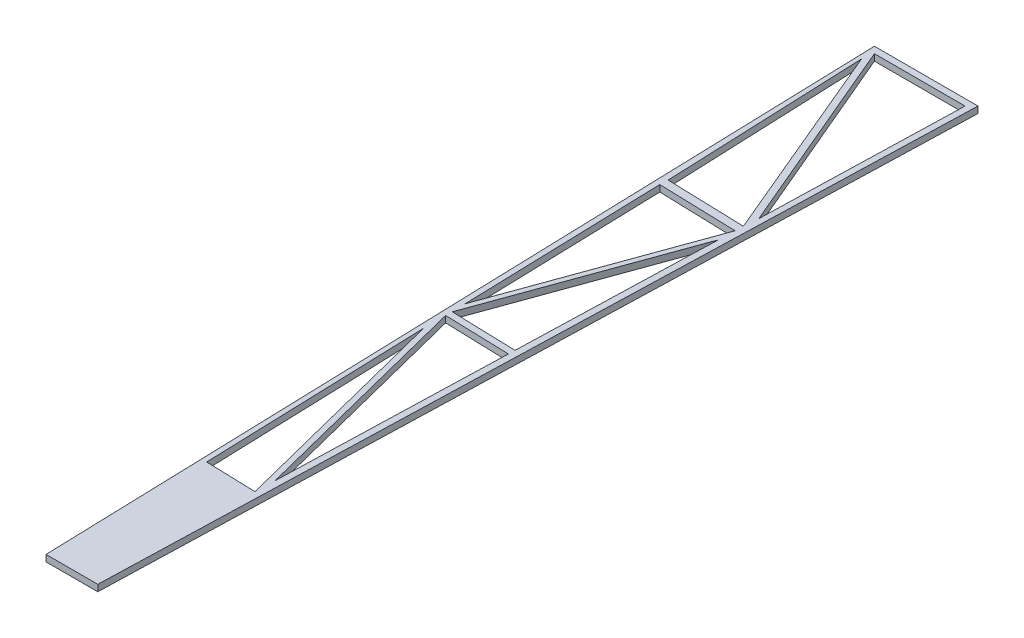
ISO-10303-21;
HEADER;
FILE_DESCRIPTION(('STEP AP214'),'2;1');
FILE_NAME('part.step','',(''),(''),'','','');
FILE_SCHEMA(('AUTOMOTIVE_DESIGN { 1 0 10303 214 1 1 1 1 }'));
ENDSEC;
DATA;
#1=APPLICATION_CONTEXT('core data for automotive mechanical design processes');
#2=APPLICATION_PROTOCOL_DEFINITION('international standard','automotive_design',2000,#1);
#3=PRODUCT_CONTEXT('',#1,'mechanical');
#4=PRODUCT('Part','Part','',(#3));
#5=PRODUCT_RELATED_PRODUCT_CATEGORY('part','',(#4));
#6=PRODUCT_DEFINITION_FORMATION('','',#4);
#7=PRODUCT_DEFINITION_CONTEXT('part definition',#1,'design');
#8=PRODUCT_DEFINITION('design','',#6,#7);
#9=PRODUCT_DEFINITION_SHAPE('','',#8);
#10=(LENGTH_UNIT() NAMED_UNIT(*) SI_UNIT(.MILLI.,.METRE.));
#11=(NAMED_UNIT(*) PLANE_ANGLE_UNIT() SI_UNIT($,.RADIAN.));
#12=(NAMED_UNIT(*) SI_UNIT($,.STERADIAN.) SOLID_ANGLE_UNIT());
#13=UNCERTAINTY_MEASURE_WITH_UNIT(LENGTH_MEASURE(1.E-05),#10,'distance_accuracy_value','');
#14=(GEOMETRIC_REPRESENTATION_CONTEXT(3) GLOBAL_UNCERTAINTY_ASSIGNED_CONTEXT((#13)) GLOBAL_UNIT_ASSIGNED_CONTEXT((#10,
#11,#12)) REPRESENTATION_CONTEXT('',''));
#15=CARTESIAN_POINT('',(0.,0.,0.));
#16=DIRECTION('',(0.,0.,1.));
#17=DIRECTION('',(1.,0.,0.));
#18=AXIS2_PLACEMENT_3D('',#15,#16,#17);
#19=CARTESIAN_POINT('',(0.,-6.35,0.));
#20=DIRECTION('',(0.,1.,0.));
#21=DIRECTION('',(0.,0.,1.));
#22=AXIS2_PLACEMENT_3D('',#19,#20,#21);
#23=PLANE('',#22);
#24=DIRECTION('',(-0.245501132463587,0.,-0.969396303871175));
#25=VECTOR('',#24,1.);
#26=CARTESIAN_POINT('',(-4.46864474714376,-6.35,549.131141067288));
#27=LINE('',#26,#25);
#28=CARTESIAN_POINT('',(-4.46864474714376,-6.35,549.131141067288));
#29=VERTEX_POINT('',#28);
#30=CARTESIAN_POINT('',(-60.5902036283198,-6.35,327.527146002337));
#31=VERTEX_POINT('',#30);
#32=EDGE_CURVE('E41',#29,#31,#27,.T.);
#33=ORIENTED_EDGE('',*,*,#32,.T.);
#34=DIRECTION('',(0.0329144085991016,0.,0.999458174065614));
#35=VECTOR('',#34,1.);
#36=CARTESIAN_POINT('',(-60.5902036283198,-6.35,327.527146002337));
#37=LINE('',#36,#35);
#38=CARTESIAN_POINT('',(-53.3411371192526,-6.35,547.647727996641));
#39=VERTEX_POINT('',#38);
#40=EDGE_CURVE('E493',#31,#39,#37,.T.);
#41=ORIENTED_EDGE('',*,*,#40,.T.);
#42=DIRECTION('',(0.999539674242945,0.,0.0303387477379543));
#43=VECTOR('',#42,1.);
#44=CARTESIAN_POINT('',(-53.3411371192526,-6.35,547.647727996641));
#45=LINE('',#44,#43);
#46=EDGE_CURVE('E497',#39,#29,#45,.T.);
#47=ORIENTED_EDGE('',*,*,#46,.T.);
#48=EDGE_LOOP('',(#33,#41,#47));
#49=FACE_BOUND('',#48,.T.);
#50=DIRECTION('',(-0.0303387477379533,0.,0.999539674242945));
#51=VECTOR('',#50,1.);
#52=CARTESIAN_POINT('',(2.85209508202437,-6.35,307.942217672465));
#53=LINE('',#52,#51);
#54=CARTESIAN_POINT('',(2.85209508202437,-6.35,307.942217672465));
#55=VERTEX_POINT('',#54);
#56=CARTESIAN_POINT('',(-3.89069160273572,-6.35,530.08991027296));
#57=VERTEX_POINT('',#56);
#58=EDGE_CURVE('E121',#55,#57,#53,.T.);
#59=ORIENTED_EDGE('',*,*,#58,.F.);
#60=DIRECTION('',(0.999539674242945,0.,0.0303387477379536));
#61=VECTOR('',#60,1.);
#62=CARTESIAN_POINT('',(-60.6186742324026,-6.35,306.015707191105));
#63=LINE('',#62,#61);
#64=CARTESIAN_POINT('',(-60.6186742324026,-6.35,306.015707191105));
#65=VERTEX_POINT('',#64);
#66=EDGE_CURVE('E137',#65,#55,#63,.T.);
#67=ORIENTED_EDGE('',*,*,#66,.F.);
#68=DIRECTION('',(-0.245423234194724,0.,-0.969416028399264));
#69=VECTOR('',#68,1.);
#70=CARTESIAN_POINT('',(-3.89069160273574,-6.35,530.08991027296));
#71=LINE('',#70,#69);
#72=EDGE_CURVE('E136',#57,#65,#71,.T.);
#73=ORIENTED_EDGE('',*,*,#72,.F.);
#74=EDGE_LOOP('',(#59,#67,#73));
#75=FACE_BOUND('',#74,.T.);
#76=DIRECTION('',(0.340191619237659,0.,-0.940356135833898));
#77=VECTOR('',#76,1.);
#78=CARTESIAN_POINT('',(-60.4260231842666,-6.35,299.668630259663));
#79=LINE('',#78,#77);
#80=CARTESIAN_POINT('',(-60.4260231842666,-6.35,299.668630259663));
#81=VERTEX_POINT('',#80);
#82=CARTESIAN_POINT('',(8.92154058158288,-6.35,107.97840802996));
#83=VERTEX_POINT('',#82);
#84=EDGE_CURVE('E163',#81,#83,#79,.T.);
#85=ORIENTED_EDGE('',*,*,#84,.F.);
#86=DIRECTION('',(-0.999539674242945,0.,-0.0303387477379536));
#87=VECTOR('',#86,1.);
#88=CARTESIAN_POINT('',(-60.4260231842666,-6.35,299.668630259663));
#89=LINE('',#88,#87);
#90=CARTESIAN_POINT('',(3.04474613016037,-6.35,301.595140741023));
#91=VERTEX_POINT('',#90);
#92=EDGE_CURVE('E162',#91,#81,#89,.T.);
#93=ORIENTED_EDGE('',*,*,#92,.F.);
#94=DIRECTION('',(-0.030338747737953,0.,0.999539674242945));
#95=VECTOR('',#94,1.);
#96=CARTESIAN_POINT('',(8.92154058158288,-6.35,107.97840802996));
#97=LINE('',#96,#95);
#98=EDGE_CURVE('E166',#83,#91,#97,.T.);
#99=ORIENTED_EDGE('',*,*,#98,.F.);
#100=EDGE_LOOP('',(#85,#93,#99));
#101=FACE_BOUND('',#100,.T.);
#102=DIRECTION('',(-0.387967835428389,0.,-0.921672913062443));
#103=VECTOR('',#102,1.);
#104=CARTESIAN_POINT('',(9.6416400991912,-6.35,84.2540261447994));
#105=LINE('',#104,#103);
#106=CARTESIAN_POINT('',(9.6416400991912,-6.35,84.2540261447993));
#107=VERTEX_POINT('',#106);
#108=CARTESIAN_POINT('',(-74.5704193402612,-6.35,-115.803728779253));
#109=VERTEX_POINT('',#108);
#110=EDGE_CURVE('E203',#107,#109,#105,.T.);
#111=ORIENTED_EDGE('',*,*,#110,.T.);
#112=DIRECTION('',(0.0408961841220737,0.,0.999163401113278));
#113=VECTOR('',#112,1.);
#114=CARTESIAN_POINT('',(-74.5704193402612,-6.35,-115.803728779253));
#115=LINE('',#114,#113);
#116=CARTESIAN_POINT('',(-66.4765355102244,-6.35,81.9436324830006));
#117=VERTEX_POINT('',#116);
#118=EDGE_CURVE('E204',#109,#117,#115,.T.);
#119=ORIENTED_EDGE('',*,*,#118,.T.);
#120=DIRECTION('',(0.999539674242945,0.,0.0303387477379532));
#121=VECTOR('',#120,1.);
#122=CARTESIAN_POINT('',(-66.4765355102244,-6.35,81.9436324830006));
#123=LINE('',#122,#121);
#124=EDGE_CURVE('E208',#117,#107,#123,.T.);
#125=ORIENTED_EDGE('',*,*,#124,.T.);
#126=EDGE_LOOP('',(#111,#119,#125));
#127=FACE_BOUND('',#126,.T.);
#128=DIRECTION('',(0.0279216387235691,0.,-0.999610115040354));
#129=VECTOR('',#128,1.);
#130=CARTESIAN_POINT('',(12.6910029543834,-6.35,0.354491810557295));
#131=LINE('',#130,#129);
#132=CARTESIAN_POINT('',(10.7392364169303,-6.35,70.2288137424059));
#133=VERTEX_POINT('',#132);
#134=CARTESIAN_POINT('',(16.2356109996648,-6.35,-126.544437403288));
#135=VERTEX_POINT('',#134);
#136=EDGE_CURVE('E243',#133,#135,#131,.T.);
#137=ORIENTED_EDGE('',*,*,#136,.T.);
#138=DIRECTION('',(-1.,0.,0.));
#139=VECTOR('',#138,1.);
#140=CARTESIAN_POINT('',(0.,-6.35,-126.544437403288));
#141=LINE('',#140,#139);
#142=CARTESIAN_POINT('',(-72.6643890003352,-6.35,-126.544437403288));
#143=VERTEX_POINT('',#142);
#144=EDGE_CURVE('E247',#135,#143,#141,.T.);
#145=ORIENTED_EDGE('',*,*,#144,.T.);
#146=DIRECTION('',(0.390248714589986,0.,0.920709476849708));
#147=VECTOR('',#146,1.);
#148=CARTESIAN_POINT('',(-16.1298978592947,-6.35,6.83676237111765));
#149=LINE('',#148,#147);
#150=EDGE_CURVE('E80',#143,#133,#149,.T.);
#151=ORIENTED_EDGE('',*,*,#150,.T.);
#152=EDGE_LOOP('',(#137,#145,#151));
#153=FACE_BOUND('',#152,.T.);
#154=DIRECTION('',(0.0303030631207921,0.,0.999540756730558));
#155=VECTOR('',#154,1.);
#156=CARTESIAN_POINT('',(-53.644264616562,-6.35,703.934276044682));
#157=LINE('',#156,#155);
#158=CARTESIAN_POINT('',(-79.0143889841291,-6.35,-132.894436868735));
#159=VERTEX_POINT('',#158);
#160=CARTESIAN_POINT('',(-53.6143890003352,-6.35,704.919717547149));
#161=VERTEX_POINT('',#160);
#162=EDGE_CURVE('E268',#159,#161,#157,.T.);
#163=ORIENTED_EDGE('',*,*,#162,.F.);
#164=DIRECTION('',(-1.,0.,0.));
#165=VECTOR('',#164,1.);
#166=CARTESIAN_POINT('',(-79.0143890003352,-6.35,-132.894437403288));
#167=LINE('',#166,#165);
#168=CARTESIAN_POINT('',(22.5856109996648,-6.35,-132.894437403288));
#169=VERTEX_POINT('',#168);
#170=EDGE_CURVE('E254',#169,#159,#167,.T.);
#171=ORIENTED_EDGE('',*,*,#170,.F.);
#172=DIRECTION('',(0.0303387477379532,0.,-0.999539674242945));
#173=VECTOR('',#172,1.);
#174=CARTESIAN_POINT('',(-2.81438900033517,-6.35,703.933369237212));
#175=LINE('',#174,#173);
#176=CARTESIAN_POINT('',(-2.84432735428753,-6.35,704.919717547149));
#177=VERTEX_POINT('',#176);
#178=EDGE_CURVE('E251',#177,#169,#175,.T.);
#179=ORIENTED_EDGE('',*,*,#178,.F.);
#180=DIRECTION('',(1.,0.,0.));
#181=VECTOR('',#180,1.);
#182=CARTESIAN_POINT('',(-53.6143890003352,-6.35,704.919717547149));
#183=LINE('',#182,#181);
#184=EDGE_CURVE('E255',#161,#177,#183,.T.);
#185=ORIENTED_EDGE('',*,*,#184,.F.);
#186=EDGE_LOOP('',(#163,#171,#179,#185));
#187=FACE_BOUND('',#186,.T.);
#188=DIRECTION('',(0.0295282684399608,0.,0.999563945609753));
#189=VECTOR('',#188,1.);
#190=CARTESIAN_POINT('',(-66.762692458664,-6.35,89.8297894257815));
#191=LINE('',#190,#189);
#192=CARTESIAN_POINT('',(-66.762692458664,-6.35,89.8297894257815));
#193=VERTEX_POINT('',#192);
#194=CARTESIAN_POINT('',(-60.9500528162577,-6.35,286.593952119061));
#195=VERTEX_POINT('',#194);
#196=EDGE_CURVE('E182',#193,#195,#191,.T.);
#197=ORIENTED_EDGE('',*,*,#196,.T.);
#198=DIRECTION('',(0.340215000473728,0.,-0.940347676900763));
#199=VECTOR('',#198,1.);
#200=CARTESIAN_POINT('',(-60.9500528162577,-6.35,286.593952119061));
#201=LINE('',#200,#199);
#202=CARTESIAN_POINT('',(9.40223071864843,-6.35,92.1416020034135));
#203=VERTEX_POINT('',#202);
#204=EDGE_CURVE('E183',#195,#203,#201,.T.);
#205=ORIENTED_EDGE('',*,*,#204,.T.);
#206=DIRECTION('',(-0.999539674242945,0.,-0.0303387477379535));
#207=VECTOR('',#206,1.);
#208=CARTESIAN_POINT('',(-66.762692458664,-6.35,89.8297894257815));
#209=LINE('',#208,#207);
#210=EDGE_CURVE('E187',#203,#193,#209,.T.);
#211=ORIENTED_EDGE('',*,*,#210,.T.);
#212=EDGE_LOOP('',(#197,#205,#211));
#213=FACE_BOUND('',#212,.T.);
#214=DIRECTION('',(-0.999914944690269,0.,-0.0130423688437863));
#215=VECTOR('',#214,1.);
#216=CARTESIAN_POINT('',(-53.1624114911146,-6.35,552.188291025686));
#217=LINE('',#216,#215);
#218=CARTESIAN_POINT('',(-4.27157027048392,-6.35,552.825997650303));
#219=VERTEX_POINT('',#218);
#220=CARTESIAN_POINT('',(-53.1624114911146,-6.35,552.188291025686));
#221=VERTEX_POINT('',#220);
#222=EDGE_CURVE('E32',#219,#221,#217,.T.);
#223=ORIENTED_EDGE('',*,*,#222,.T.);
#224=DIRECTION('',(0.0303030631207921,0.,0.999540756730558));
#225=VECTOR('',#224,1.);
#226=CARTESIAN_POINT('',(-53.1624114911146,-6.35,552.188291025686));
#227=LINE('',#226,#225);
#228=CARTESIAN_POINT('',(-48.6771372043778,-6.35,700.134207807708));
#229=VERTEX_POINT('',#228);
#230=EDGE_CURVE('E457',#221,#229,#227,.T.);
#231=ORIENTED_EDGE('',*,*,#230,.T.);
#232=DIRECTION('',(0.999999776901084,0.,-0.000667980375344258));
#233=VECTOR('',#232,1.);
#234=CARTESIAN_POINT('',(-7.66909464802849,-6.35,700.106815233938));
#235=LINE('',#234,#233);
#236=CARTESIAN_POINT('',(-7.66909464802849,-6.35,700.106815233938));
#237=VERTEX_POINT('',#236);
#238=EDGE_CURVE('E477',#229,#237,#235,.T.);
#239=ORIENTED_EDGE('',*,*,#238,.T.);
#240=DIRECTION('',(0.0230622072871611,0.,-0.999734031928014));
#241=VECTOR('',#240,1.);
#242=CARTESIAN_POINT('',(-4.27157027048392,-6.35,552.825997650303));
#243=LINE('',#242,#241);
#244=EDGE_CURVE('E473',#237,#219,#243,.T.);
#245=ORIENTED_EDGE('',*,*,#244,.T.);
#246=EDGE_LOOP('',(#223,#231,#239,#245));
#247=FACE_BOUND('',#246,.T.);
#248=ADVANCED_FACE('F16',(#49,#75,#101,#127,#153,#187,#213,#247),#23,.F.);
#249=CARTESIAN_POINT('',(0.,0.,0.));
#250=DIRECTION('',(0.,1.,0.));
#251=DIRECTION('',(0.,0.,1.));
#252=AXIS2_PLACEMENT_3D('',#249,#250,#251);
#253=PLANE('',#252);
#254=DIRECTION('',(-0.340215000473728,0.,0.940347676900763));
#255=VECTOR('',#254,1.);
#256=CARTESIAN_POINT('',(37.7919346227782,0.,13.6730098573408));
#257=LINE('',#256,#255);
#258=CARTESIAN_POINT('',(9.40223071864843,0.,92.1416020034135));
#259=VERTEX_POINT('',#258);
#260=CARTESIAN_POINT('',(-60.9500528162577,2.22044604925031E-13,286.593952119061));
#261=VERTEX_POINT('',#260);
#262=EDGE_CURVE('E284',#259,#261,#257,.T.);
#263=ORIENTED_EDGE('',*,*,#262,.T.);
#264=DIRECTION('',(-0.0295282684399608,0.,-0.999563945609753));
#265=VECTOR('',#264,1.);
#266=CARTESIAN_POINT('',(-69.35584231674,0.,2.04885134043025));
#267=LINE('',#266,#265);
#268=CARTESIAN_POINT('',(-66.762692458664,2.22044604925031E-13,89.8297894257815));
#269=VERTEX_POINT('',#268);
#270=EDGE_CURVE('E287',#261,#269,#267,.T.);
#271=ORIENTED_EDGE('',*,*,#270,.T.);
#272=DIRECTION('',(0.999539674242945,0.,0.0303387477379535));
#273=VECTOR('',#272,1.);
#274=CARTESIAN_POINT('',(-2.78551981111819,0.,91.7716706256563));
#275=LINE('',#274,#273);
#276=EDGE_CURVE('E281',#269,#259,#275,.T.);
#277=ORIENTED_EDGE('',*,*,#276,.T.);
#278=EDGE_LOOP('',(#263,#271,#277));
#279=FACE_BOUND('',#278,.T.);
#280=DIRECTION('',(0.0303030631207921,0.,0.999540756730558));
#281=VECTOR('',#280,1.);
#282=CARTESIAN_POINT('',(-53.644264616562,0.,703.934276044682));
#283=LINE('',#282,#281);
#284=CARTESIAN_POINT('',(-79.0143889841291,0.,-132.894436868735));
#285=VERTEX_POINT('',#284);
#286=CARTESIAN_POINT('',(-53.6143890003352,0.,704.919717547149));
#287=VERTEX_POINT('',#286);
#288=EDGE_CURVE('E250',#285,#287,#283,.T.);
#289=ORIENTED_EDGE('',*,*,#288,.T.);
#290=DIRECTION('',(1.,0.,0.));
#291=VECTOR('',#290,1.);
#292=CARTESIAN_POINT('',(-53.6143890003352,0.,704.919717547149));
#293=LINE('',#292,#291);
#294=CARTESIAN_POINT('',(-2.84432735428753,0.,704.919717547149));
#295=VERTEX_POINT('',#294);
#296=EDGE_CURVE('E264',#287,#295,#293,.T.);
#297=ORIENTED_EDGE('',*,*,#296,.T.);
#298=DIRECTION('',(0.0303387477379532,0.,-0.999539674242945));
#299=VECTOR('',#298,1.);
#300=CARTESIAN_POINT('',(-2.81438900033517,0.,703.933369237212));
#301=LINE('',#300,#299);
#302=CARTESIAN_POINT('',(22.5856109996648,0.,-132.894437403288));
#303=VERTEX_POINT('',#302);
#304=EDGE_CURVE('E259',#295,#303,#301,.T.);
#305=ORIENTED_EDGE('',*,*,#304,.T.);
#306=DIRECTION('',(-1.,0.,0.));
#307=VECTOR('',#306,1.);
#308=CARTESIAN_POINT('',(-79.0143890003352,0.,-132.894437403288));
#309=LINE('',#308,#307);
#310=EDGE_CURVE('E263',#303,#285,#309,.T.);
#311=ORIENTED_EDGE('',*,*,#310,.T.);
#312=EDGE_LOOP('',(#289,#297,#305,#311));
#313=FACE_BOUND('',#312,.T.);
#314=DIRECTION('',(-1.,0.,0.));
#315=VECTOR('',#314,1.);
#316=CARTESIAN_POINT('',(-72.6643890003352,0.,-126.544437403288));
#317=LINE('',#316,#315);
#318=CARTESIAN_POINT('',(16.2356109996648,0.,-126.544437403288));
#319=VERTEX_POINT('',#318);
#320=CARTESIAN_POINT('',(-72.6643890003352,0.,-126.544437403288));
#321=VERTEX_POINT('',#320);
#322=EDGE_CURVE('E224',#319,#321,#317,.T.);
#323=ORIENTED_EDGE('',*,*,#322,.F.);
#324=DIRECTION('',(0.0279216387235691,0.,-0.999610115040354));
#325=VECTOR('',#324,1.);
#326=CARTESIAN_POINT('',(16.2356109996648,0.,-126.544437403288));
#327=LINE('',#326,#325);
#328=CARTESIAN_POINT('',(10.7392364169303,0.,70.2288137424059));
#329=VERTEX_POINT('',#328);
#330=EDGE_CURVE('E228',#329,#319,#327,.T.);
#331=ORIENTED_EDGE('',*,*,#330,.F.);
#332=DIRECTION('',(0.390248714589986,0.,0.920709476849708));
#333=VECTOR('',#332,1.);
#334=CARTESIAN_POINT('',(-72.6643890003352,0.,-126.544437403288));
#335=LINE('',#334,#333);
#336=EDGE_CURVE('E225',#321,#329,#335,.T.);
#337=ORIENTED_EDGE('',*,*,#336,.F.);
#338=EDGE_LOOP('',(#323,#331,#337));
#339=FACE_BOUND('',#338,.T.);
#340=DIRECTION('',(-0.0408961841220737,0.,-0.999163401113278));
#341=VECTOR('',#340,1.);
#342=CARTESIAN_POINT('',(-69.7137319324215,0.,2.85341277889939));
#343=LINE('',#342,#341);
#344=CARTESIAN_POINT('',(-66.4765355102244,0.,81.9436324830006));
#345=VERTEX_POINT('',#344);
#346=CARTESIAN_POINT('',(-74.5704193402612,0.,-115.803728779253));
#347=VERTEX_POINT('',#346);
#348=EDGE_CURVE('E275',#345,#347,#343,.T.);
#349=ORIENTED_EDGE('',*,*,#348,.T.);
#350=DIRECTION('',(0.387967835428389,0.,0.921672913062444));
#351=VECTOR('',#350,1.);
#352=CARTESIAN_POINT('',(-21.9371182377658,0.,9.23418292717692));
#353=LINE('',#352,#351);
#354=CARTESIAN_POINT('',(9.6416400991912,0.,84.2540261447994));
#355=VERTEX_POINT('',#354);
#356=EDGE_CURVE('E278',#347,#355,#353,.T.);
#357=ORIENTED_EDGE('',*,*,#356,.T.);
#358=DIRECTION('',(-0.999539674242945,0.,-0.0303387477379532));
#359=VECTOR('',#358,1.);
#360=CARTESIAN_POINT('',(-2.54611043057535,0.,83.8840947670421));
#361=LINE('',#360,#359);
#362=EDGE_CURVE('E272',#355,#345,#361,.T.);
#363=ORIENTED_EDGE('',*,*,#362,.T.);
#364=EDGE_LOOP('',(#349,#357,#363));
#365=FACE_BOUND('',#364,.T.);
#366=DIRECTION('',(0.999539674242945,0.,0.0303387477379536));
#367=VECTOR('',#366,1.);
#368=CARTESIAN_POINT('',(-9.14300439960638,0.,301.225209363265));
#369=LINE('',#368,#367);
#370=CARTESIAN_POINT('',(-60.4260231842666,2.22044604925031E-13,299.668630259663));
#371=VERTEX_POINT('',#370);
#372=CARTESIAN_POINT('',(3.04474613016037,0.,301.595140741023));
#373=VERTEX_POINT('',#372);
#374=EDGE_CURVE('E296',#371,#373,#369,.T.);
#375=ORIENTED_EDGE('',*,*,#374,.F.);
#376=DIRECTION('',(-0.340191619237659,0.,0.940356135833898));
#377=VECTOR('',#376,1.);
#378=CARTESIAN_POINT('',(42.4314782406213,0.,15.3503898568427));
#379=LINE('',#378,#377);
#380=CARTESIAN_POINT('',(8.92154058158287,2.22044604925031E-13,107.97840802996));
#381=VERTEX_POINT('',#380);
#382=EDGE_CURVE('E293',#381,#371,#379,.T.);
#383=ORIENTED_EDGE('',*,*,#382,.F.);
#384=DIRECTION('',(0.030338747737953,0.,-0.999539674242945));
#385=VECTOR('',#384,1.);
#386=CARTESIAN_POINT('',(12.1877505297666,0.,0.369931377757215));
#387=LINE('',#386,#385);
#388=EDGE_CURVE('E290',#373,#381,#387,.T.);
#389=ORIENTED_EDGE('',*,*,#388,.F.);
#390=EDGE_LOOP('',(#375,#383,#389));
#391=FACE_BOUND('',#390,.T.);
#392=DIRECTION('',(-0.999539674242945,0.,-0.0303387477379536));
#393=VECTOR('',#392,1.);
#394=CARTESIAN_POINT('',(-9.33565544774238,0.,307.572286294708));
#395=LINE('',#394,#393);
#396=CARTESIAN_POINT('',(2.85209508202437,0.,307.942217672465));
#397=VERTEX_POINT('',#396);
#398=CARTESIAN_POINT('',(-60.6186742324026,0.,306.015707191105));
#399=VERTEX_POINT('',#398);
#400=EDGE_CURVE('E302',#397,#399,#395,.T.);
#401=ORIENTED_EDGE('',*,*,#400,.F.);
#402=DIRECTION('',(0.0303387477379533,0.,-0.999539674242945));
#403=VECTOR('',#402,1.);
#404=CARTESIAN_POINT('',(12.1877505297666,0.,0.369931377757221));
#405=LINE('',#404,#403);
#406=CARTESIAN_POINT('',(-3.89069160273575,0.,530.08991027296));
#407=VERTEX_POINT('',#406);
#408=EDGE_CURVE('E300',#407,#397,#405,.T.);
#409=ORIENTED_EDGE('',*,*,#408,.F.);
#410=DIRECTION('',(0.245423234194724,0.,0.969416028399264));
#411=VECTOR('',#410,1.);
#412=CARTESIAN_POINT('',(-129.77386146822,0.,32.8543369022481));
#413=LINE('',#412,#411);
#414=EDGE_CURVE('E145',#399,#407,#413,.T.);
#415=ORIENTED_EDGE('',*,*,#414,.F.);
#416=EDGE_LOOP('',(#401,#409,#415));
#417=FACE_BOUND('',#416,.T.);
#418=DIRECTION('',(-0.0329144085991016,0.,-0.999458174065614));
#419=VECTOR('',#418,1.);
#420=CARTESIAN_POINT('',(-71.299083959655,0.,2.34803941083749));
#421=LINE('',#420,#419);
#422=CARTESIAN_POINT('',(-53.3411371192526,0.,547.647727996641));
#423=VERTEX_POINT('',#422);
#424=CARTESIAN_POINT('',(-60.5902036283198,0.,327.527146002337));
#425=VERTEX_POINT('',#424);
#426=EDGE_CURVE('E308',#423,#425,#421,.T.);
#427=ORIENTED_EDGE('',*,*,#426,.T.);
#428=DIRECTION('',(0.245501132463587,0.,0.969396303871175));
#429=VECTOR('',#428,1.);
#430=CARTESIAN_POINT('',(-134.88587774538,0.,34.160059830635));
#431=LINE('',#430,#429);
#432=CARTESIAN_POINT('',(-4.46864474714376,0.,549.131141067288));
#433=VERTEX_POINT('',#432);
#434=EDGE_CURVE('E25',#425,#433,#431,.T.);
#435=ORIENTED_EDGE('',*,*,#434,.T.);
#436=DIRECTION('',(-0.999539674242945,0.,-0.0303387477379543));
#437=VECTOR('',#436,1.);
#438=CARTESIAN_POINT('',(-16.656395276911,0.,548.761209689531));
#439=LINE('',#438,#437);
#440=EDGE_CURVE('E305',#433,#423,#439,.T.);
#441=ORIENTED_EDGE('',*,*,#440,.T.);
#442=EDGE_LOOP('',(#427,#435,#441));
#443=FACE_BOUND('',#442,.T.);
#444=ADVANCED_FACE('F325',(#279,#313,#339,#365,#391,#417,#443),#253,.T.);
#445=CARTESIAN_POINT('',(-53.644264616562,-6.35,703.934276044682));
#446=DIRECTION('',(-0.999540756730558,0.,0.0303030631207921));
#447=DIRECTION('',(0.0303030631207921,0.,0.999540756730558));
#448=AXIS2_PLACEMENT_3D('',#445,#446,#447);
#449=PLANE('',#448);
#450=ORIENTED_EDGE('',*,*,#288,.F.);
#451=DIRECTION('',(0.,1.,0.));
#452=VECTOR('',#451,1.);
#453=CARTESIAN_POINT('',(-79.0143889841291,-6.35,-132.894436868735));
#454=LINE('',#453,#452);
#455=EDGE_CURVE('E258',#159,#285,#454,.T.);
#456=ORIENTED_EDGE('',*,*,#455,.F.);
#457=ORIENTED_EDGE('',*,*,#162,.T.);
#458=DIRECTION('',(0.,1.,0.));
#459=VECTOR('',#458,1.);
#460=CARTESIAN_POINT('',(-53.6143890003352,-6.35,704.919717547149));
#461=LINE('',#460,#459);
#462=EDGE_CURVE('E71',#161,#287,#461,.T.);
#463=ORIENTED_EDGE('',*,*,#462,.T.);
#464=EDGE_LOOP('',(#450,#456,#457,#463));
#465=FACE_BOUND('',#464,.T.);
#466=ADVANCED_FACE('F18',(#465),#449,.T.);
#467=CARTESIAN_POINT('',(-53.6143890003352,-6.35,704.919717547149));
#468=DIRECTION('',(0.,0.,1.));
#469=DIRECTION('',(1.,0.,0.));
#470=AXIS2_PLACEMENT_3D('',#467,#468,#469);
#471=PLANE('',#470);
#472=ORIENTED_EDGE('',*,*,#296,.F.);
#473=ORIENTED_EDGE('',*,*,#462,.F.);
#474=ORIENTED_EDGE('',*,*,#184,.T.);
#475=DIRECTION('',(0.,1.,0.));
#476=VECTOR('',#475,1.);
#477=CARTESIAN_POINT('',(-2.84432735428753,-6.35,704.919717547149));
#478=LINE('',#477,#476);
#479=EDGE_CURVE('E271',#177,#295,#478,.T.);
#480=ORIENTED_EDGE('',*,*,#479,.T.);
#481=EDGE_LOOP('',(#472,#473,#474,#480));
#482=FACE_BOUND('',#481,.T.);
#483=ADVANCED_FACE('F337',(#482),#471,.T.);
#484=CARTESIAN_POINT('',(-2.81438900033517,-6.35,703.933369237212));
#485=DIRECTION('',(0.999539674242945,0.,0.0303387477379532));
#486=DIRECTION('',(0.0303387477379532,0.,-0.999539674242945));
#487=AXIS2_PLACEMENT_3D('',#484,#485,#486);
#488=PLANE('',#487);
#489=ORIENTED_EDGE('',*,*,#304,.F.);
#490=ORIENTED_EDGE('',*,*,#479,.F.);
#491=ORIENTED_EDGE('',*,*,#178,.T.);
#492=DIRECTION('',(0.,1.,0.));
#493=VECTOR('',#492,1.);
#494=CARTESIAN_POINT('',(22.5856109996648,-6.35,-132.894437403288));
#495=LINE('',#494,#493);
#496=EDGE_CURVE('E269',#169,#303,#495,.T.);
#497=ORIENTED_EDGE('',*,*,#496,.T.);
#498=EDGE_LOOP('',(#489,#490,#491,#497));
#499=FACE_BOUND('',#498,.T.);
#500=ADVANCED_FACE('F340',(#499),#488,.T.);
#501=CARTESIAN_POINT('',(-79.0143890003352,-6.35,-132.894437403288));
#502=DIRECTION('',(0.,0.,-1.));
#503=DIRECTION('',(-1.,0.,0.));
#504=AXIS2_PLACEMENT_3D('',#501,#502,#503);
#505=PLANE('',#504);
#506=ORIENTED_EDGE('',*,*,#310,.F.);
#507=ORIENTED_EDGE('',*,*,#496,.F.);
#508=ORIENTED_EDGE('',*,*,#170,.T.);
#509=ORIENTED_EDGE('',*,*,#455,.T.);
#510=EDGE_LOOP('',(#506,#507,#508,#509));
#511=FACE_BOUND('',#510,.T.);
#512=ADVANCED_FACE('F331',(#511),#505,.T.);
#513=CARTESIAN_POINT('',(-72.6643890003352,-41.177235626826,-126.544437403288));
#514=DIRECTION('',(0.,0.,-1.));
#515=DIRECTION('',(-1.,0.,0.));
#516=AXIS2_PLACEMENT_3D('',#513,#514,#515);
#517=PLANE('',#516);
#518=DIRECTION('',(0.,1.,0.));
#519=VECTOR('',#518,1.);
#520=CARTESIAN_POINT('',(16.2356109996648,-41.177235626826,-126.544437403288));
#521=LINE('',#520,#519);
#522=EDGE_CURVE('E232',#135,#319,#521,.T.);
#523=ORIENTED_EDGE('',*,*,#522,.T.);
#524=ORIENTED_EDGE('',*,*,#322,.T.);
#525=DIRECTION('',(0.,1.,0.));
#526=VECTOR('',#525,1.);
#527=CARTESIAN_POINT('',(-72.6643890003352,-41.177235626826,-126.544437403288));
#528=LINE('',#527,#526);
#529=EDGE_CURVE('E241',#143,#321,#528,.T.);
#530=ORIENTED_EDGE('',*,*,#529,.F.);
#531=ORIENTED_EDGE('',*,*,#144,.F.);
#532=EDGE_LOOP('',(#523,#524,#530,#531));
#533=FACE_BOUND('',#532,.T.);
#534=ADVANCED_FACE('F348',(#533),#517,.F.);
#535=CARTESIAN_POINT('',(-72.6643890003352,-41.177235626826,-126.544437403288));
#536=DIRECTION('',(-0.920709476849708,0.,0.390248714589986));
#537=DIRECTION('',(0.390248714589986,0.,0.920709476849708));
#538=AXIS2_PLACEMENT_3D('',#535,#536,#537);
#539=PLANE('',#538);
#540=ORIENTED_EDGE('',*,*,#529,.T.);
#541=ORIENTED_EDGE('',*,*,#336,.T.);
#542=DIRECTION('',(0.,1.,0.));
#543=VECTOR('',#542,1.);
#544=CARTESIAN_POINT('',(10.7392364169303,-41.177235626826,70.2288137424059));
#545=LINE('',#544,#543);
#546=EDGE_CURVE('E238',#133,#329,#545,.T.);
#547=ORIENTED_EDGE('',*,*,#546,.F.);
#548=ORIENTED_EDGE('',*,*,#150,.F.);
#549=EDGE_LOOP('',(#540,#541,#547,#548));
#550=FACE_BOUND('',#549,.T.);
#551=ADVANCED_FACE('F361',(#550),#539,.F.);
#552=CARTESIAN_POINT('',(16.2356109996648,-41.177235626826,-126.544437403288));
#553=DIRECTION('',(0.999610115040354,0.,0.0279216387235691));
#554=DIRECTION('',(0.0279216387235691,0.,-0.999610115040354));
#555=AXIS2_PLACEMENT_3D('',#552,#553,#554);
#556=PLANE('',#555);
#557=ORIENTED_EDGE('',*,*,#546,.T.);
#558=ORIENTED_EDGE('',*,*,#330,.T.);
#559=ORIENTED_EDGE('',*,*,#522,.F.);
#560=ORIENTED_EDGE('',*,*,#136,.F.);
#561=EDGE_LOOP('',(#557,#558,#559,#560));
#562=FACE_BOUND('',#561,.T.);
#563=ADVANCED_FACE('F365',(#562),#556,.F.);
#564=CARTESIAN_POINT('',(9.6416400991912,97.5740949473572,84.2540261447994));
#565=DIRECTION('',(-0.921672913062444,0.,0.387967835428389));
#566=DIRECTION('',(0.387967835428389,0.,0.921672913062444));
#567=AXIS2_PLACEMENT_3D('',#564,#565,#566);
#568=PLANE('',#567);
#569=DIRECTION('',(0.,-1.,0.));
#570=VECTOR('',#569,1.);
#571=CARTESIAN_POINT('',(-74.5704193402612,97.5740949473572,-115.803728779253));
#572=LINE('',#571,#570);
#573=EDGE_CURVE('E221',#347,#109,#572,.T.);
#574=ORIENTED_EDGE('',*,*,#573,.T.);
#575=ORIENTED_EDGE('',*,*,#110,.F.);
#576=DIRECTION('',(0.,-1.,0.));
#577=VECTOR('',#576,1.);
#578=CARTESIAN_POINT('',(9.6416400991912,97.5740949473572,84.2540261447994));
#579=LINE('',#578,#577);
#580=EDGE_CURVE('E212',#355,#107,#579,.T.);
#581=ORIENTED_EDGE('',*,*,#580,.F.);
#582=ORIENTED_EDGE('',*,*,#356,.F.);
#583=EDGE_LOOP('',(#574,#575,#581,#582));
#584=FACE_BOUND('',#583,.T.);
#585=ADVANCED_FACE('F368',(#584),#568,.T.);
#586=CARTESIAN_POINT('',(-74.5704193402612,97.5740949473572,-115.803728779253));
#587=DIRECTION('',(0.999163401113278,0.,-0.0408961841220737));
#588=DIRECTION('',(-0.0408961841220737,0.,-0.999163401113278));
#589=AXIS2_PLACEMENT_3D('',#586,#587,#588);
#590=PLANE('',#589);
#591=DIRECTION('',(0.,-1.,0.));
#592=VECTOR('',#591,1.);
#593=CARTESIAN_POINT('',(-66.4765355102244,97.5740949473572,81.9436324830006));
#594=LINE('',#593,#592);
#595=EDGE_CURVE('E218',#345,#117,#594,.T.);
#596=ORIENTED_EDGE('',*,*,#595,.T.);
#597=ORIENTED_EDGE('',*,*,#118,.F.);
#598=ORIENTED_EDGE('',*,*,#573,.F.);
#599=ORIENTED_EDGE('',*,*,#348,.F.);
#600=EDGE_LOOP('',(#596,#597,#598,#599));
#601=FACE_BOUND('',#600,.T.);
#602=ADVANCED_FACE('F372',(#601),#590,.T.);
#603=CARTESIAN_POINT('',(-66.4765355102244,97.5740949473572,81.9436324830006));
#604=DIRECTION('',(0.0303387477379532,0.,-0.999539674242945));
#605=DIRECTION('',(-0.999539674242945,0.,-0.0303387477379532));
#606=AXIS2_PLACEMENT_3D('',#603,#604,#605);
#607=PLANE('',#606);
#608=ORIENTED_EDGE('',*,*,#580,.T.);
#609=ORIENTED_EDGE('',*,*,#124,.F.);
#610=ORIENTED_EDGE('',*,*,#595,.F.);
#611=ORIENTED_EDGE('',*,*,#362,.F.);
#612=EDGE_LOOP('',(#608,#609,#610,#611));
#613=FACE_BOUND('',#612,.T.);
#614=ADVANCED_FACE('F376',(#613),#607,.T.);
#615=CARTESIAN_POINT('',(-66.762692458664,545.092028941115,89.8297894257815));
#616=DIRECTION('',(0.999563945609753,0.,-0.0295282684399608));
#617=DIRECTION('',(-0.0295282684399608,0.,-0.999563945609753));
#618=AXIS2_PLACEMENT_3D('',#615,#616,#617);
#619=PLANE('',#618);
#620=DIRECTION('',(0.,-1.,0.));
#621=VECTOR('',#620,1.);
#622=CARTESIAN_POINT('',(-60.9500528162577,545.092028941115,286.593952119061));
#623=LINE('',#622,#621);
#624=EDGE_CURVE('E200',#261,#195,#623,.T.);
#625=ORIENTED_EDGE('',*,*,#624,.T.);
#626=ORIENTED_EDGE('',*,*,#196,.F.);
#627=DIRECTION('',(0.,-1.,0.));
#628=VECTOR('',#627,1.);
#629=CARTESIAN_POINT('',(-66.762692458664,545.092028941115,89.8297894257815));
#630=LINE('',#629,#628);
#631=EDGE_CURVE('E191',#269,#193,#630,.T.);
#632=ORIENTED_EDGE('',*,*,#631,.F.);
#633=ORIENTED_EDGE('',*,*,#270,.F.);
#634=EDGE_LOOP('',(#625,#626,#632,#633));
#635=FACE_BOUND('',#634,.T.);
#636=ADVANCED_FACE('F380',(#635),#619,.T.);
#637=CARTESIAN_POINT('',(-60.9500528162577,545.092028941115,286.593952119061));
#638=DIRECTION('',(-0.940347676900763,0.,-0.340215000473728));
#639=DIRECTION('',(-0.340215000473728,0.,0.940347676900763));
#640=AXIS2_PLACEMENT_3D('',#637,#638,#639);
#641=PLANE('',#640);
#642=DIRECTION('',(0.,-1.,0.));
#643=VECTOR('',#642,1.);
#644=CARTESIAN_POINT('',(9.40223071864843,545.092028941115,92.1416020034135));
#645=LINE('',#644,#643);
#646=EDGE_CURVE('E197',#259,#203,#645,.T.);
#647=ORIENTED_EDGE('',*,*,#646,.T.);
#648=ORIENTED_EDGE('',*,*,#204,.F.);
#649=ORIENTED_EDGE('',*,*,#624,.F.);
#650=ORIENTED_EDGE('',*,*,#262,.F.);
#651=EDGE_LOOP('',(#647,#648,#649,#650));
#652=FACE_BOUND('',#651,.T.);
#653=ADVANCED_FACE('F384',(#652),#641,.T.);
#654=CARTESIAN_POINT('',(-66.762692458664,545.092028941115,89.8297894257815));
#655=DIRECTION('',(-0.0303387477379535,0.,0.999539674242945));
#656=DIRECTION('',(0.999539674242945,0.,0.0303387477379535));
#657=AXIS2_PLACEMENT_3D('',#654,#655,#656);
#658=PLANE('',#657);
#659=ORIENTED_EDGE('',*,*,#631,.T.);
#660=ORIENTED_EDGE('',*,*,#210,.F.);
#661=ORIENTED_EDGE('',*,*,#646,.F.);
#662=ORIENTED_EDGE('',*,*,#276,.F.);
#663=EDGE_LOOP('',(#659,#660,#661,#662));
#664=FACE_BOUND('',#663,.T.);
#665=ADVANCED_FACE('F388',(#664),#658,.T.);
#666=CARTESIAN_POINT('',(-60.4260231842666,545.092028941115,299.668630259663));
#667=DIRECTION('',(-0.0303387477379536,0.,0.999539674242945));
#668=DIRECTION('',(0.999539674242945,0.,0.0303387477379536));
#669=AXIS2_PLACEMENT_3D('',#666,#667,#668);
#670=PLANE('',#669);
#671=ORIENTED_EDGE('',*,*,#374,.T.);
#672=DIRECTION('',(0.,-1.,0.));
#673=VECTOR('',#672,1.);
#674=CARTESIAN_POINT('',(3.04474613016037,545.092028941115,301.595140741023));
#675=LINE('',#674,#673);
#676=EDGE_CURVE('E170',#373,#91,#675,.T.);
#677=ORIENTED_EDGE('',*,*,#676,.T.);
#678=ORIENTED_EDGE('',*,*,#92,.T.);
#679=DIRECTION('',(0.,-1.,0.));
#680=VECTOR('',#679,1.);
#681=CARTESIAN_POINT('',(-60.4260231842666,545.092028941115,299.668630259663));
#682=LINE('',#681,#680);
#683=EDGE_CURVE('E179',#371,#81,#682,.T.);
#684=ORIENTED_EDGE('',*,*,#683,.F.);
#685=EDGE_LOOP('',(#671,#677,#678,#684));
#686=FACE_BOUND('',#685,.T.);
#687=ADVANCED_FACE('F392',(#686),#670,.F.);
#688=CARTESIAN_POINT('',(-60.4260231842666,545.092028941115,299.668630259663));
#689=DIRECTION('',(-0.940356135833898,0.,-0.340191619237659));
#690=DIRECTION('',(-0.340191619237659,0.,0.940356135833898));
#691=AXIS2_PLACEMENT_3D('',#688,#689,#690);
#692=PLANE('',#691);
#693=ORIENTED_EDGE('',*,*,#382,.T.);
#694=ORIENTED_EDGE('',*,*,#683,.T.);
#695=ORIENTED_EDGE('',*,*,#84,.T.);
#696=DIRECTION('',(0.,-1.,0.));
#697=VECTOR('',#696,1.);
#698=CARTESIAN_POINT('',(8.92154058158287,545.092028941115,107.97840802996));
#699=LINE('',#698,#697);
#700=EDGE_CURVE('E176',#381,#83,#699,.T.);
#701=ORIENTED_EDGE('',*,*,#700,.F.);
#702=EDGE_LOOP('',(#693,#694,#695,#701));
#703=FACE_BOUND('',#702,.T.);
#704=ADVANCED_FACE('F396',(#703),#692,.F.);
#705=CARTESIAN_POINT('',(8.92154058158288,545.092028941115,107.97840802996));
#706=DIRECTION('',(0.999539674242945,0.,0.030338747737953));
#707=DIRECTION('',(0.030338747737953,0.,-0.999539674242945));
#708=AXIS2_PLACEMENT_3D('',#705,#706,#707);
#709=PLANE('',#708);
#710=ORIENTED_EDGE('',*,*,#388,.T.);
#711=ORIENTED_EDGE('',*,*,#700,.T.);
#712=ORIENTED_EDGE('',*,*,#98,.T.);
#713=ORIENTED_EDGE('',*,*,#676,.F.);
#714=EDGE_LOOP('',(#710,#711,#712,#713));
#715=FACE_BOUND('',#714,.T.);
#716=ADVANCED_FACE('F400',(#715),#709,.F.);
#717=CARTESIAN_POINT('',(-60.6186742324026,436.597872797989,306.015707191105));
#718=DIRECTION('',(0.0303387477379536,0.,-0.999539674242945));
#719=DIRECTION('',(-0.999539674242945,0.,-0.0303387477379536));
#720=AXIS2_PLACEMENT_3D('',#717,#718,#719);
#721=PLANE('',#720);
#722=ORIENTED_EDGE('',*,*,#400,.T.);
#723=DIRECTION('',(0.,-1.,0.));
#724=VECTOR('',#723,1.);
#725=CARTESIAN_POINT('',(-60.6186742324026,436.597872797989,306.015707191105));
#726=LINE('',#725,#724);
#727=EDGE_CURVE('E146',#399,#65,#726,.T.);
#728=ORIENTED_EDGE('',*,*,#727,.T.);
#729=ORIENTED_EDGE('',*,*,#66,.T.);
#730=DIRECTION('',(0.,-1.,0.));
#731=VECTOR('',#730,1.);
#732=CARTESIAN_POINT('',(2.85209508202437,436.597872797989,307.942217672465));
#733=LINE('',#732,#731);
#734=EDGE_CURVE('E130',#397,#55,#733,.T.);
#735=ORIENTED_EDGE('',*,*,#734,.F.);
#736=EDGE_LOOP('',(#722,#728,#729,#735));
#737=FACE_BOUND('',#736,.T.);
#738=ADVANCED_FACE('F404',(#737),#721,.F.);
#739=CARTESIAN_POINT('',(2.85209508202437,436.597872797989,307.942217672465));
#740=DIRECTION('',(0.999539674242945,0.,0.0303387477379533));
#741=DIRECTION('',(0.0303387477379533,0.,-0.999539674242945));
#742=AXIS2_PLACEMENT_3D('',#739,#740,#741);
#743=PLANE('',#742);
#744=ORIENTED_EDGE('',*,*,#408,.T.);
#745=ORIENTED_EDGE('',*,*,#734,.T.);
#746=ORIENTED_EDGE('',*,*,#58,.T.);
#747=DIRECTION('',(0.,-1.,0.));
#748=VECTOR('',#747,1.);
#749=CARTESIAN_POINT('',(-3.89069160273575,436.597872797989,530.08991027296));
#750=LINE('',#749,#748);
#751=EDGE_CURVE('E126',#407,#57,#750,.T.);
#752=ORIENTED_EDGE('',*,*,#751,.F.);
#753=EDGE_LOOP('',(#744,#745,#746,#752));
#754=FACE_BOUND('',#753,.T.);
#755=ADVANCED_FACE('F124',(#754),#743,.F.);
#756=CARTESIAN_POINT('',(-3.89069160273574,436.597872797989,530.08991027296));
#757=DIRECTION('',(-0.969416028399263,0.,0.245423234194724));
#758=DIRECTION('',(0.245423234194724,0.,0.969416028399264));
#759=AXIS2_PLACEMENT_3D('',#756,#757,#758);
#760=PLANE('',#759);
#761=ORIENTED_EDGE('',*,*,#414,.T.);
#762=ORIENTED_EDGE('',*,*,#751,.T.);
#763=ORIENTED_EDGE('',*,*,#72,.T.);
#764=ORIENTED_EDGE('',*,*,#727,.F.);
#765=EDGE_LOOP('',(#761,#762,#763,#764));
#766=FACE_BOUND('',#765,.T.);
#767=ADVANCED_FACE('F142',(#766),#760,.F.);
#768=CARTESIAN_POINT('',(-4.46864474714376,436.597872797989,549.131141067288));
#769=DIRECTION('',(-0.969396303871175,0.,0.245501132463587));
#770=DIRECTION('',(0.245501132463587,0.,0.969396303871175));
#771=AXIS2_PLACEMENT_3D('',#768,#769,#770);
#772=PLANE('',#771);
#773=DIRECTION('',(0.,-1.,0.));
#774=VECTOR('',#773,1.);
#775=CARTESIAN_POINT('',(-60.5902036283198,436.597872797989,327.527146002337));
#776=LINE('',#775,#774);
#777=EDGE_CURVE('E159',#425,#31,#776,.T.);
#778=ORIENTED_EDGE('',*,*,#777,.T.);
#779=ORIENTED_EDGE('',*,*,#32,.F.);
#780=DIRECTION('',(0.,-1.,0.));
#781=VECTOR('',#780,1.);
#782=CARTESIAN_POINT('',(-4.46864474714376,436.597872797989,549.131141067288));
#783=LINE('',#782,#781);
#784=EDGE_CURVE('E501',#433,#29,#783,.T.);
#785=ORIENTED_EDGE('',*,*,#784,.F.);
#786=ORIENTED_EDGE('',*,*,#434,.F.);
#787=EDGE_LOOP('',(#778,#779,#785,#786));
#788=FACE_BOUND('',#787,.T.);
#789=ADVANCED_FACE('F413',(#788),#772,.T.);
#790=CARTESIAN_POINT('',(-60.5902036283198,436.597872797989,327.527146002337));
#791=DIRECTION('',(0.999458174065614,0.,-0.0329144085991016));
#792=DIRECTION('',(-0.0329144085991016,0.,-0.999458174065614));
#793=AXIS2_PLACEMENT_3D('',#790,#791,#792);
#794=PLANE('',#793);
#795=DIRECTION('',(0.,-1.,0.));
#796=VECTOR('',#795,1.);
#797=CARTESIAN_POINT('',(-53.3411371192526,436.597872797989,547.647727996641));
#798=LINE('',#797,#796);
#799=EDGE_CURVE('E504',#423,#39,#798,.T.);
#800=ORIENTED_EDGE('',*,*,#799,.T.);
#801=ORIENTED_EDGE('',*,*,#40,.F.);
#802=ORIENTED_EDGE('',*,*,#777,.F.);
#803=ORIENTED_EDGE('',*,*,#426,.F.);
#804=EDGE_LOOP('',(#800,#801,#802,#803));
#805=FACE_BOUND('',#804,.T.);
#806=ADVANCED_FACE('F416',(#805),#794,.T.);
#807=CARTESIAN_POINT('',(-53.3411371192526,436.597872797989,547.647727996641));
#808=DIRECTION('',(0.0303387477379543,0.,-0.999539674242945));
#809=DIRECTION('',(-0.999539674242945,0.,-0.0303387477379543));
#810=AXIS2_PLACEMENT_3D('',#807,#808,#809);
#811=PLANE('',#810);
#812=ORIENTED_EDGE('',*,*,#784,.T.);
#813=ORIENTED_EDGE('',*,*,#46,.F.);
#814=ORIENTED_EDGE('',*,*,#799,.F.);
#815=ORIENTED_EDGE('',*,*,#440,.F.);
#816=EDGE_LOOP('',(#812,#813,#814,#815));
#817=FACE_BOUND('',#816,.T.);
#818=ADVANCED_FACE('F419',(#817),#811,.T.);
#819=CARTESIAN_POINT('',(-53.1624114911146,-1.27,552.188291025686));
#820=DIRECTION('',(-0.0130423688437863,0.,0.999914944690268));
#821=DIRECTION('',(0.999914944690268,0.,0.0130423688437863));
#822=AXIS2_PLACEMENT_3D('',#819,#820,#821);
#823=PLANE('',#822);
#824=ORIENTED_EDGE('',*,*,#222,.F.);
#825=DIRECTION('',(0.,-1.,0.));
#826=VECTOR('',#825,1.);
#827=CARTESIAN_POINT('',(-4.27157027048392,-1.27,552.825997650303));
#828=LINE('',#827,#826);
#829=CARTESIAN_POINT('',(-4.27157027048392,-1.27,552.825997650303));
#830=VERTEX_POINT('',#829);
#831=EDGE_CURVE('E470',#830,#219,#828,.T.);
#832=ORIENTED_EDGE('',*,*,#831,.F.);
#833=DIRECTION('',(-0.999914944690269,0.,-0.0130423688437863));
#834=VECTOR('',#833,1.);
#835=CARTESIAN_POINT('',(-53.1624114911146,-1.27,552.188291025686));
#836=LINE('',#835,#834);
#837=CARTESIAN_POINT('',(-53.1624114911146,-1.27,552.188291025686));
#838=VERTEX_POINT('',#837);
#839=EDGE_CURVE('E464',#830,#838,#836,.T.);
#840=ORIENTED_EDGE('',*,*,#839,.T.);
#841=DIRECTION('',(0.,-1.,0.));
#842=VECTOR('',#841,1.);
#843=CARTESIAN_POINT('',(-53.1624114911146,-1.27,552.188291025686));
#844=LINE('',#843,#842);
#845=EDGE_CURVE('E491',#838,#221,#844,.T.);
#846=ORIENTED_EDGE('',*,*,#845,.T.);
#847=EDGE_LOOP('',(#824,#832,#840,#846));
#848=FACE_BOUND('',#847,.T.);
#849=ADVANCED_FACE('F423',(#848),#823,.T.);
#850=CARTESIAN_POINT('',(-53.1624114911146,-1.27,552.188291025686));
#851=DIRECTION('',(0.999540756730558,0.,-0.0303030631207921));
#852=DIRECTION('',(-0.0303030631207921,0.,-0.999540756730559));
#853=AXIS2_PLACEMENT_3D('',#850,#851,#852);
#854=PLANE('',#853);
#855=ORIENTED_EDGE('',*,*,#230,.F.);
#856=ORIENTED_EDGE('',*,*,#845,.F.);
#857=DIRECTION('',(0.0303030631207921,0.,0.999540756730558));
#858=VECTOR('',#857,1.);
#859=CARTESIAN_POINT('',(-53.1624114911146,-1.27,552.188291025686));
#860=LINE('',#859,#858);
#861=CARTESIAN_POINT('',(-48.6771372043778,-1.27,700.134207807708));
#862=VERTEX_POINT('',#861);
#863=EDGE_CURVE('E460',#838,#862,#860,.T.);
#864=ORIENTED_EDGE('',*,*,#863,.T.);
#865=DIRECTION('',(0.,-1.,0.));
#866=VECTOR('',#865,1.);
#867=CARTESIAN_POINT('',(-48.6771372043778,-1.27,700.134207807708));
#868=LINE('',#867,#866);
#869=EDGE_CURVE('E488',#862,#229,#868,.T.);
#870=ORIENTED_EDGE('',*,*,#869,.T.);
#871=EDGE_LOOP('',(#855,#856,#864,#870));
#872=FACE_BOUND('',#871,.T.);
#873=ADVANCED_FACE('F427',(#872),#854,.T.);
#874=CARTESIAN_POINT('',(-7.66909464802849,-1.27,700.106815233938));
#875=DIRECTION('',(-0.000667980375344258,0.,-0.999999776901084));
#876=DIRECTION('',(-0.999999776901084,0.,0.000667980375344258));
#877=AXIS2_PLACEMENT_3D('',#874,#875,#876);
#878=PLANE('',#877);
#879=ORIENTED_EDGE('',*,*,#238,.F.);
#880=ORIENTED_EDGE('',*,*,#869,.F.);
#881=DIRECTION('',(0.999999776901084,0.,-0.000667980375344258));
#882=VECTOR('',#881,1.);
#883=CARTESIAN_POINT('',(-7.66909464802849,-1.27,700.106815233938));
#884=LINE('',#883,#882);
#885=CARTESIAN_POINT('',(-7.66909464802849,-1.27,700.106815233938));
#886=VERTEX_POINT('',#885);
#887=EDGE_CURVE('E463',#862,#886,#884,.T.);
#888=ORIENTED_EDGE('',*,*,#887,.T.);
#889=DIRECTION('',(0.,-1.,0.));
#890=VECTOR('',#889,1.);
#891=CARTESIAN_POINT('',(-7.66909464802849,-1.27,700.106815233938));
#892=LINE('',#891,#890);
#893=EDGE_CURVE('E485',#886,#237,#892,.T.);
#894=ORIENTED_EDGE('',*,*,#893,.T.);
#895=EDGE_LOOP('',(#879,#880,#888,#894));
#896=FACE_BOUND('',#895,.T.);
#897=ADVANCED_FACE('F430',(#896),#878,.T.);
#898=CARTESIAN_POINT('',(-4.27157027048392,-1.27,552.825997650303));
#899=DIRECTION('',(-0.999734031928014,0.,-0.0230622072871611));
#900=DIRECTION('',(-0.0230622072871611,0.,0.999734031928014));
#901=AXIS2_PLACEMENT_3D('',#898,#899,#900);
#902=PLANE('',#901);
#903=ORIENTED_EDGE('',*,*,#244,.F.);
#904=ORIENTED_EDGE('',*,*,#893,.F.);
#905=DIRECTION('',(0.0230622072871611,0.,-0.999734031928014));
#906=VECTOR('',#905,1.);
#907=CARTESIAN_POINT('',(-4.27157027048392,-1.27,552.825997650303));
#908=LINE('',#907,#906);
#909=EDGE_CURVE('E467',#886,#830,#908,.T.);
#910=ORIENTED_EDGE('',*,*,#909,.T.);
#911=ORIENTED_EDGE('',*,*,#831,.T.);
#912=EDGE_LOOP('',(#903,#904,#910,#911));
#913=FACE_BOUND('',#912,.T.);
#914=ADVANCED_FACE('F434',(#913),#902,.T.);
#915=CARTESIAN_POINT('',(0.,-1.27,0.));
#916=DIRECTION('',(0.,-1.,0.));
#917=DIRECTION('',(0.,0.,-1.));
#918=AXIS2_PLACEMENT_3D('',#915,#916,#917);
#919=PLANE('',#918);
#920=CARTESIAN_POINT('',(-29.6082292836358,-1.27,620.835421888807));
#921=DIRECTION('',(0.,-1.,0.));
#922=DIRECTION('',(0.,0.,-1.));
#923=AXIS2_PLACEMENT_3D('',#920,#921,#922);
#924=CIRCLE('',#923,3.17499999999997);
#925=CARTESIAN_POINT('',(-29.6082292836358,-1.27,617.660421888807));
#926=VERTEX_POINT('',#925);
#927=EDGE_CURVE('E10',#926,#926,#924,.T.);
#928=ORIENTED_EDGE('',*,*,#927,.F.);
#929=EDGE_LOOP('',(#928));
#930=FACE_BOUND('',#929,.T.);
#931=ORIENTED_EDGE('',*,*,#839,.F.);
#932=ORIENTED_EDGE('',*,*,#909,.F.);
#933=ORIENTED_EDGE('',*,*,#887,.F.);
#934=ORIENTED_EDGE('',*,*,#863,.F.);
#935=EDGE_LOOP('',(#931,#932,#933,#934));
#936=FACE_BOUND('',#935,.T.);
#937=ADVANCED_FACE('F438',(#930,#936),#919,.T.);
#938=CARTESIAN_POINT('',(-29.6082292836358,-4.445,620.835421888807));
#939=DIRECTION('',(0.,1.,0.));
#940=DIRECTION('',(0.,0.,1.));
#941=AXIS2_PLACEMENT_3D('',#938,#939,#940);
#942=CYLINDRICAL_SURFACE('',#941,3.17499999999997);
#943=CARTESIAN_POINT('',(-29.6082292836358,-4.445,620.835421888807));
#944=DIRECTION('',(0.,1.,0.));
#945=DIRECTION('',(0.999914944690268,0.,0.0130423688437885));
#946=AXIS2_PLACEMENT_3D('',#943,#944,#945);
#947=CIRCLE('',#946,3.17499999999997);
#948=CARTESIAN_POINT('',(-26.4334993342443,-4.445,620.876831409886));
#949=VERTEX_POINT('',#948);
#950=EDGE_CURVE('E454',#949,#949,#947,.T.);
#951=ORIENTED_EDGE('',*,*,#950,.T.);
#952=EDGE_LOOP('',(#951));
#953=FACE_BOUND('',#952,.T.);
#954=ORIENTED_EDGE('',*,*,#927,.T.);
#955=EDGE_LOOP('',(#954));
#956=FACE_BOUND('',#955,.T.);
#957=ADVANCED_FACE('F442',(#953,#956),#942,.T.);
#958=CARTESIAN_POINT('',(-29.6082292836358,-4.445,620.835421888807));
#959=DIRECTION('',(0.,1.,0.));
#960=DIRECTION('',(0.,0.,1.));
#961=AXIS2_PLACEMENT_3D('',#958,#959,#960);
#962=PLANE('',#961);
#963=ORIENTED_EDGE('',*,*,#950,.F.);
#964=EDGE_LOOP('',(#963));
#965=FACE_BOUND('',#964,.T.);
#966=ADVANCED_FACE('F446',(#965),#962,.F.);
#967=CLOSED_SHELL('',(#248,#444,#466,#483,#500,#512,#534,#551,#563,#585,#602,#614,#636,#653,
#665,#687,#704,#716,#738,#755,#767,#789,#806,#818,#849,#873,#897,#914,#937,#957,#966));
#968=MANIFOLD_SOLID_BREP('B1',#967);
#969=ADVANCED_BREP_SHAPE_REPRESENTATION('',(#18,#968),#14);
#970=SHAPE_DEFINITION_REPRESENTATION(#9,#969);
ENDSEC;
END-ISO-10303-21;
